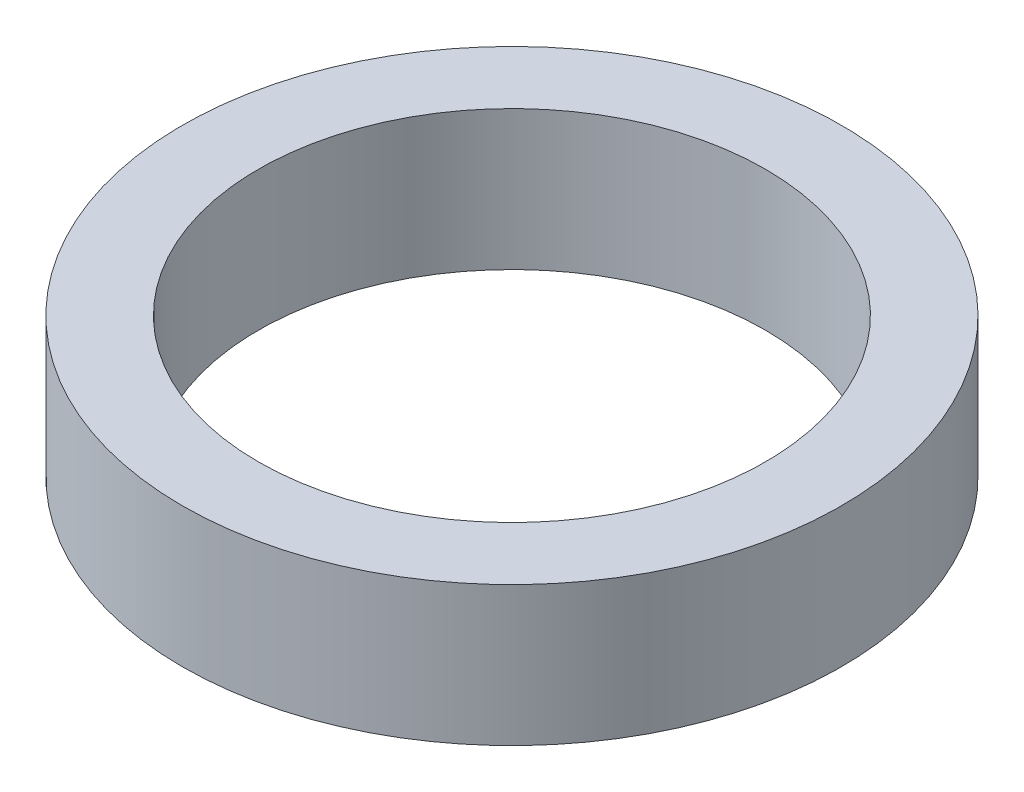
ISO-10303-21;
HEADER;
FILE_DESCRIPTION(('STEP AP214'),'2;1');
FILE_NAME('part.step','',(''),(''),'','','');
FILE_SCHEMA(('AUTOMOTIVE_DESIGN { 1 0 10303 214 1 1 1 1 }'));
ENDSEC;
DATA;
#1=APPLICATION_CONTEXT('core data for automotive mechanical design processes');
#2=APPLICATION_PROTOCOL_DEFINITION('international standard','automotive_design',2000,#1);
#3=PRODUCT_CONTEXT('',#1,'mechanical');
#4=PRODUCT('Part','Part','',(#3));
#5=PRODUCT_RELATED_PRODUCT_CATEGORY('part','',(#4));
#6=PRODUCT_DEFINITION_FORMATION('','',#4);
#7=PRODUCT_DEFINITION_CONTEXT('part definition',#1,'design');
#8=PRODUCT_DEFINITION('design','',#6,#7);
#9=PRODUCT_DEFINITION_SHAPE('','',#8);
#10=(LENGTH_UNIT() NAMED_UNIT(*) SI_UNIT(.MILLI.,.METRE.));
#11=(NAMED_UNIT(*) PLANE_ANGLE_UNIT() SI_UNIT($,.RADIAN.));
#12=(NAMED_UNIT(*) SI_UNIT($,.STERADIAN.) SOLID_ANGLE_UNIT());
#13=UNCERTAINTY_MEASURE_WITH_UNIT(LENGTH_MEASURE(1.E-05),#10,'distance_accuracy_value','');
#14=(GEOMETRIC_REPRESENTATION_CONTEXT(3) GLOBAL_UNCERTAINTY_ASSIGNED_CONTEXT((#13)) GLOBAL_UNIT_ASSIGNED_CONTEXT((#10,
#11,#12)) REPRESENTATION_CONTEXT('',''));
#15=CARTESIAN_POINT('',(0.,0.,0.));
#16=DIRECTION('',(0.,0.,1.));
#17=DIRECTION('',(1.,0.,0.));
#18=AXIS2_PLACEMENT_3D('',#15,#16,#17);
#19=CARTESIAN_POINT('',(0.,5.5,0.));
#20=DIRECTION('',(0.,-1.,0.));
#21=DIRECTION('',(0.,0.,-1.));
#22=AXIS2_PLACEMENT_3D('',#19,#20,#21);
#23=CYLINDRICAL_SURFACE('',#22,13.);
#24=CARTESIAN_POINT('',(0.,5.5,0.));
#25=DIRECTION('',(0.,1.,0.));
#26=DIRECTION('',(0.,0.,1.));
#27=AXIS2_PLACEMENT_3D('',#24,#25,#26);
#28=CIRCLE('',#27,13.);
#29=CARTESIAN_POINT('',(0.,5.5,13.));
#30=VERTEX_POINT('',#29);
#31=EDGE_CURVE('E10',#30,#30,#28,.T.);
#32=ORIENTED_EDGE('',*,*,#31,.F.);
#33=EDGE_LOOP('',(#32));
#34=FACE_BOUND('',#33,.T.);
#35=CARTESIAN_POINT('',(0.,0.,0.));
#36=DIRECTION('',(0.,1.,0.));
#37=DIRECTION('',(0.,0.,1.));
#38=AXIS2_PLACEMENT_3D('',#35,#36,#37);
#39=CIRCLE('',#38,13.);
#40=CARTESIAN_POINT('',(0.,0.,13.));
#41=VERTEX_POINT('',#40);
#42=EDGE_CURVE('E40',#41,#41,#39,.T.);
#43=ORIENTED_EDGE('',*,*,#42,.T.);
#44=EDGE_LOOP('',(#43));
#45=FACE_BOUND('',#44,.T.);
#46=ADVANCED_FACE('F37',(#34,#45),#23,.T.);
#47=CARTESIAN_POINT('',(0.,5.5,0.));
#48=DIRECTION('',(0.,1.,0.));
#49=DIRECTION('',(0.,0.,1.));
#50=AXIS2_PLACEMENT_3D('',#47,#48,#49);
#51=PLANE('',#50);
#52=CARTESIAN_POINT('',(0.,5.5,0.));
#53=DIRECTION('',(0.,1.,0.));
#54=DIRECTION('',(0.,0.,1.));
#55=AXIS2_PLACEMENT_3D('',#52,#53,#54);
#56=CIRCLE('',#55,10.);
#57=CARTESIAN_POINT('',(0.,5.5,10.));
#58=VERTEX_POINT('',#57);
#59=EDGE_CURVE('E51',#58,#58,#56,.T.);
#60=ORIENTED_EDGE('',*,*,#59,.F.);
#61=EDGE_LOOP('',(#60));
#62=FACE_BOUND('',#61,.T.);
#63=ORIENTED_EDGE('',*,*,#31,.T.);
#64=EDGE_LOOP('',(#63));
#65=FACE_BOUND('',#64,.T.);
#66=ADVANCED_FACE('F68',(#62,#65),#51,.T.);
#67=CARTESIAN_POINT('',(0.,0.,0.));
#68=DIRECTION('',(0.,1.,0.));
#69=DIRECTION('',(0.,0.,1.));
#70=AXIS2_PLACEMENT_3D('',#67,#68,#69);
#71=PLANE('',#70);
#72=CARTESIAN_POINT('',(0.,0.,0.));
#73=DIRECTION('',(0.,1.,0.));
#74=DIRECTION('',(0.,0.,1.));
#75=AXIS2_PLACEMENT_3D('',#72,#73,#74);
#76=CIRCLE('',#75,10.);
#77=CARTESIAN_POINT('',(0.,0.,10.));
#78=VERTEX_POINT('',#77);
#79=EDGE_CURVE('E49',#78,#78,#76,.T.);
#80=ORIENTED_EDGE('',*,*,#79,.T.);
#81=EDGE_LOOP('',(#80));
#82=FACE_BOUND('',#81,.T.);
#83=ORIENTED_EDGE('',*,*,#42,.F.);
#84=EDGE_LOOP('',(#83));
#85=FACE_BOUND('',#84,.T.);
#86=ADVANCED_FACE('F59',(#82,#85),#71,.F.);
#87=CARTESIAN_POINT('',(0.,0.,0.));
#88=DIRECTION('',(0.,1.,0.));
#89=DIRECTION('',(0.,0.,1.));
#90=AXIS2_PLACEMENT_3D('',#87,#88,#89);
#91=CYLINDRICAL_SURFACE('',#90,10.);
#92=ORIENTED_EDGE('',*,*,#79,.F.);
#93=EDGE_LOOP('',(#92));
#94=FACE_BOUND('',#93,.T.);
#95=ORIENTED_EDGE('',*,*,#59,.T.);
#96=EDGE_LOOP('',(#95));
#97=FACE_BOUND('',#96,.T.);
#98=ADVANCED_FACE('F62',(#94,#97),#91,.F.);
#99=CLOSED_SHELL('',(#46,#66,#86,#98));
#100=MANIFOLD_SOLID_BREP('B2',#99);
#101=ADVANCED_BREP_SHAPE_REPRESENTATION('',(#18,#100),#14);
#102=SHAPE_DEFINITION_REPRESENTATION(#9,#101);
ENDSEC;
END-ISO-10303-21;
